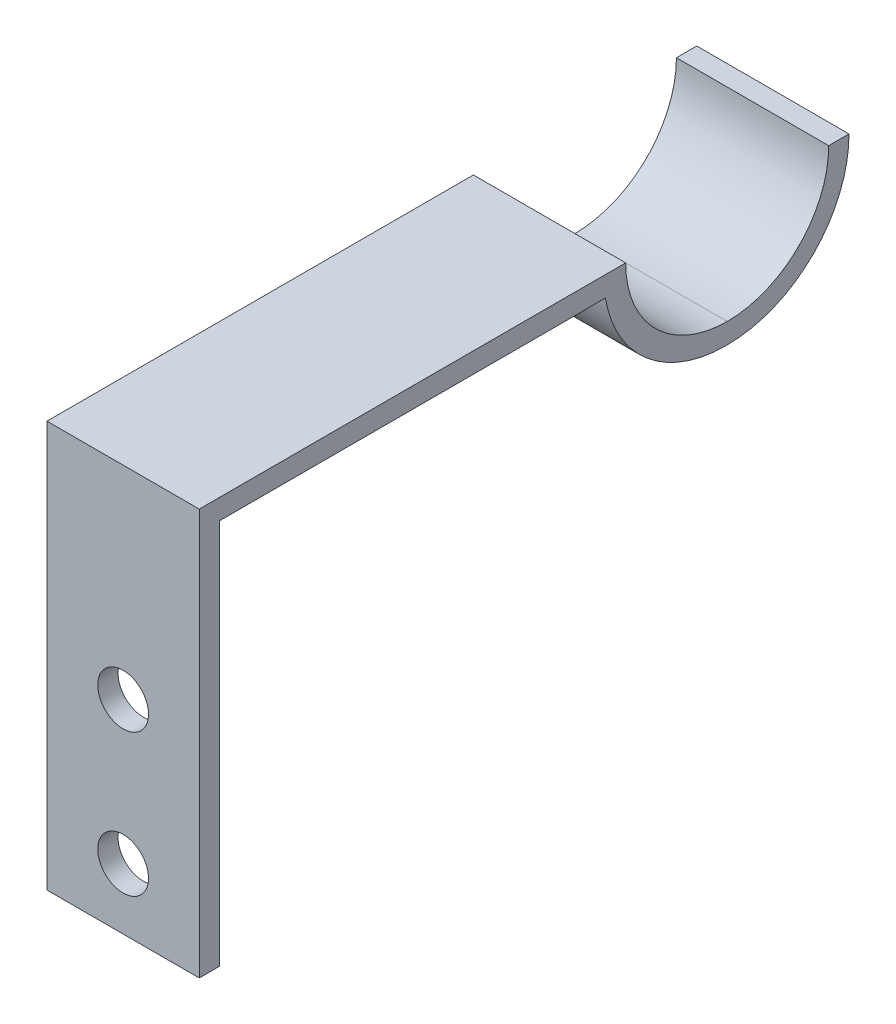
ISO-10303-21;
HEADER;
FILE_DESCRIPTION(('STEP AP214'),'2;1');
FILE_NAME('part.step','',(''),(''),'','','');
FILE_SCHEMA(('AUTOMOTIVE_DESIGN { 1 0 10303 214 1 1 1 1 }'));
ENDSEC;
DATA;
#1=APPLICATION_CONTEXT('core data for automotive mechanical design processes');
#2=APPLICATION_PROTOCOL_DEFINITION('international standard','automotive_design',2000,#1);
#3=PRODUCT_CONTEXT('',#1,'mechanical');
#4=PRODUCT('Part','Part','',(#3));
#5=PRODUCT_RELATED_PRODUCT_CATEGORY('part','',(#4));
#6=PRODUCT_DEFINITION_FORMATION('','',#4);
#7=PRODUCT_DEFINITION_CONTEXT('part definition',#1,'design');
#8=PRODUCT_DEFINITION('design','',#6,#7);
#9=PRODUCT_DEFINITION_SHAPE('','',#8);
#10=(LENGTH_UNIT() NAMED_UNIT(*) SI_UNIT(.MILLI.,.METRE.));
#11=(NAMED_UNIT(*) PLANE_ANGLE_UNIT() SI_UNIT($,.RADIAN.));
#12=(NAMED_UNIT(*) SI_UNIT($,.STERADIAN.) SOLID_ANGLE_UNIT());
#13=UNCERTAINTY_MEASURE_WITH_UNIT(LENGTH_MEASURE(1.E-05),#10,'distance_accuracy_value','');
#14=(GEOMETRIC_REPRESENTATION_CONTEXT(3) GLOBAL_UNCERTAINTY_ASSIGNED_CONTEXT((#13)) GLOBAL_UNIT_ASSIGNED_CONTEXT((#10,
#11,#12)) REPRESENTATION_CONTEXT('',''));
#15=CARTESIAN_POINT('',(0.,0.,0.));
#16=DIRECTION('',(0.,0.,1.));
#17=DIRECTION('',(1.,0.,0.));
#18=AXIS2_PLACEMENT_3D('',#15,#16,#17);
#19=CARTESIAN_POINT('',(0.,0.,0.));
#20=DIRECTION('',(0.,0.,1.));
#21=DIRECTION('',(1.,0.,0.));
#22=AXIS2_PLACEMENT_3D('',#19,#20,#21);
#23=PLANE('',#22);
#24=CARTESIAN_POINT('',(-165.075387596899,33.8666666666667,0.));
#25=DIRECTION('',(0.,0.,1.));
#26=DIRECTION('',(1.,0.,0.));
#27=AXIS2_PLACEMENT_3D('',#24,#25,#26);
#28=CIRCLE('',#27,3.175);
#29=CARTESIAN_POINT('',(-161.900387596899,33.8666666666667,0.));
#30=VERTEX_POINT('',#29);
#31=EDGE_CURVE('E156',#30,#30,#28,.T.);
#32=ORIENTED_EDGE('',*,*,#31,.T.);
#33=EDGE_LOOP('',(#32));
#34=FACE_BOUND('',#33,.T.);
#35=CARTESIAN_POINT('',(-165.075387596899,16.0866666666667,0.));
#36=DIRECTION('',(0.,0.,1.));
#37=DIRECTION('',(1.,0.,0.));
#38=AXIS2_PLACEMENT_3D('',#35,#36,#37);
#39=CIRCLE('',#38,3.175);
#40=CARTESIAN_POINT('',(-161.900387596899,16.0866666666667,0.));
#41=VERTEX_POINT('',#40);
#42=EDGE_CURVE('E160',#41,#41,#39,.T.);
#43=ORIENTED_EDGE('',*,*,#42,.T.);
#44=EDGE_LOOP('',(#43));
#45=FACE_BOUND('',#44,.T.);
#46=DIRECTION('',(-1.,0.,0.));
#47=VECTOR('',#46,1.);
#48=CARTESIAN_POINT('',(-155.550387596899,56.7266666666666,0.));
#49=LINE('',#48,#47);
#50=CARTESIAN_POINT('',(-155.550387596899,56.7266666666666,0.));
#51=VERTEX_POINT('',#50);
#52=CARTESIAN_POINT('',(-174.600387596899,56.7266666666666,0.));
#53=VERTEX_POINT('',#52);
#54=EDGE_CURVE('E137',#51,#53,#49,.T.);
#55=ORIENTED_EDGE('',*,*,#54,.F.);
#56=DIRECTION('',(0.,1.,0.));
#57=VECTOR('',#56,1.);
#58=CARTESIAN_POINT('',(-155.550387596899,59.2666666666667,0.));
#59=LINE('',#58,#57);
#60=CARTESIAN_POINT('',(-155.550387596899,8.46666666666666,0.));
#61=VERTEX_POINT('',#60);
#62=EDGE_CURVE('E173',#61,#51,#59,.T.);
#63=ORIENTED_EDGE('',*,*,#62,.F.);
#64=DIRECTION('',(1.,0.,0.));
#65=VECTOR('',#64,1.);
#66=CARTESIAN_POINT('',(-174.600387596899,8.46666666666666,0.));
#67=LINE('',#66,#65);
#68=CARTESIAN_POINT('',(-174.600387596899,8.46666666666666,0.));
#69=VERTEX_POINT('',#68);
#70=EDGE_CURVE('E181',#69,#61,#67,.T.);
#71=ORIENTED_EDGE('',*,*,#70,.F.);
#72=DIRECTION('',(0.,-1.,0.));
#73=VECTOR('',#72,1.);
#74=CARTESIAN_POINT('',(-174.600387596899,59.2666666666667,0.));
#75=LINE('',#74,#73);
#76=EDGE_CURVE('E166',#53,#69,#75,.T.);
#77=ORIENTED_EDGE('',*,*,#76,.F.);
#78=EDGE_LOOP('',(#55,#63,#71,#77));
#79=FACE_BOUND('',#78,.T.);
#80=ADVANCED_FACE('F37',(#34,#45,#79),#23,.F.);
#81=CARTESIAN_POINT('',(0.,0.,2.54));
#82=DIRECTION('',(0.,0.,1.));
#83=DIRECTION('',(1.,0.,0.));
#84=AXIS2_PLACEMENT_3D('',#81,#82,#83);
#85=PLANE('',#84);
#86=CARTESIAN_POINT('',(-165.075387596899,16.0866666666667,2.54));
#87=DIRECTION('',(0.,0.,1.));
#88=DIRECTION('',(1.,0.,0.));
#89=AXIS2_PLACEMENT_3D('',#86,#87,#88);
#90=CIRCLE('',#89,3.175);
#91=CARTESIAN_POINT('',(-161.900387596899,16.0866666666667,2.54));
#92=VERTEX_POINT('',#91);
#93=EDGE_CURVE('E163',#92,#92,#90,.T.);
#94=ORIENTED_EDGE('',*,*,#93,.F.);
#95=EDGE_LOOP('',(#94));
#96=FACE_BOUND('',#95,.T.);
#97=DIRECTION('',(0.,-1.,0.));
#98=VECTOR('',#97,1.);
#99=CARTESIAN_POINT('',(-174.600387596899,59.2666666666667,2.54));
#100=LINE('',#99,#98);
#101=CARTESIAN_POINT('',(-174.600387596899,59.2666666666667,2.54));
#102=VERTEX_POINT('',#101);
#103=CARTESIAN_POINT('',(-174.600387596899,8.46666666666666,2.54));
#104=VERTEX_POINT('',#103);
#105=EDGE_CURVE('E169',#102,#104,#100,.T.);
#106=ORIENTED_EDGE('',*,*,#105,.T.);
#107=DIRECTION('',(1.,0.,0.));
#108=VECTOR('',#107,1.);
#109=CARTESIAN_POINT('',(-174.600387596899,8.46666666666666,2.54));
#110=LINE('',#109,#108);
#111=CARTESIAN_POINT('',(-155.550387596899,8.46666666666666,2.54));
#112=VERTEX_POINT('',#111);
#113=EDGE_CURVE('E172',#104,#112,#110,.T.);
#114=ORIENTED_EDGE('',*,*,#113,.T.);
#115=DIRECTION('',(0.,1.,0.));
#116=VECTOR('',#115,1.);
#117=CARTESIAN_POINT('',(-155.550387596899,59.2666666666667,2.54));
#118=LINE('',#117,#116);
#119=CARTESIAN_POINT('',(-155.550387596899,59.2666666666667,2.54));
#120=VERTEX_POINT('',#119);
#121=EDGE_CURVE('E175',#112,#120,#118,.T.);
#122=ORIENTED_EDGE('',*,*,#121,.T.);
#123=DIRECTION('',(-1.,0.,0.));
#124=VECTOR('',#123,1.);
#125=CARTESIAN_POINT('',(-174.600387596899,59.2666666666667,2.54));
#126=LINE('',#125,#124);
#127=EDGE_CURVE('E177',#120,#102,#126,.T.);
#128=ORIENTED_EDGE('',*,*,#127,.T.);
#129=EDGE_LOOP('',(#106,#114,#122,#128));
#130=FACE_BOUND('',#129,.T.);
#131=CARTESIAN_POINT('',(-165.075387596899,33.8666666666667,2.54));
#132=DIRECTION('',(0.,0.,1.));
#133=DIRECTION('',(1.,0.,0.));
#134=AXIS2_PLACEMENT_3D('',#131,#132,#133);
#135=CIRCLE('',#134,3.175);
#136=CARTESIAN_POINT('',(-161.900387596899,33.8666666666667,2.54));
#137=VERTEX_POINT('',#136);
#138=EDGE_CURVE('E157',#137,#137,#135,.T.);
#139=ORIENTED_EDGE('',*,*,#138,.F.);
#140=EDGE_LOOP('',(#139));
#141=FACE_BOUND('',#140,.T.);
#142=ADVANCED_FACE('F237',(#96,#130,#141),#85,.T.);
#143=CARTESIAN_POINT('',(-174.600387596899,59.2666666666667,2.54));
#144=DIRECTION('',(1.,0.,0.));
#145=DIRECTION('',(0.,0.,-1.));
#146=AXIS2_PLACEMENT_3D('',#143,#144,#145);
#147=PLANE('',#146);
#148=DIRECTION('',(0.,0.,1.));
#149=VECTOR('',#148,1.);
#150=CARTESIAN_POINT('',(-174.600387596899,59.2666666666667,-76.2));
#151=LINE('',#150,#149);
#152=CARTESIAN_POINT('',(-174.600387596899,59.2666666666667,-78.74));
#153=VERTEX_POINT('',#152);
#154=CARTESIAN_POINT('',(-174.600387596899,59.2666666666667,-76.2));
#155=VERTEX_POINT('',#154);
#156=EDGE_CURVE('E144',#153,#155,#151,.T.);
#157=ORIENTED_EDGE('',*,*,#156,.F.);
#158=CARTESIAN_POINT('',(-174.600387596899,59.2666666666666,-63.5));
#159=DIRECTION('',(1.,0.,0.));
#160=DIRECTION('',(0.,0.,-1.));
#161=AXIS2_PLACEMENT_3D('',#158,#159,#160);
#162=CIRCLE('',#161,15.24);
#163=CARTESIAN_POINT('',(-174.600387596899,44.0266666666666,-63.5));
#164=VERTEX_POINT('',#163);
#165=EDGE_CURVE('E11',#153,#164,#162,.F.);
#166=ORIENTED_EDGE('',*,*,#165,.T.);
#167=DIRECTION('',(0.,0.,-1.));
#168=VECTOR('',#167,1.);
#169=CARTESIAN_POINT('',(-174.600387596899,44.0266666666666,-48.26));
#170=LINE('',#169,#168);
#171=CARTESIAN_POINT('',(-174.600387596899,44.0266666666666,-63.286842649073));
#172=VERTEX_POINT('',#171);
#173=EDGE_CURVE('E123',#172,#164,#170,.T.);
#174=ORIENTED_EDGE('',*,*,#173,.F.);
#175=CARTESIAN_POINT('',(-174.600387596899,59.2666666666666,-63.286842649073));
#176=DIRECTION('',(1.,0.,0.));
#177=DIRECTION('',(0.,0.,-1.));
#178=AXIS2_PLACEMENT_3D('',#175,#176,#177);
#179=CIRCLE('',#178,15.24);
#180=CARTESIAN_POINT('',(-174.600387596899,56.7266666666666,-48.26));
#181=VERTEX_POINT('',#180);
#182=EDGE_CURVE('E118',#172,#181,#179,.F.);
#183=ORIENTED_EDGE('',*,*,#182,.T.);
#184=DIRECTION('',(0.,0.,1.));
#185=VECTOR('',#184,1.);
#186=CARTESIAN_POINT('',(-174.600387596899,56.7266666666666,-50.8));
#187=LINE('',#186,#185);
#188=EDGE_CURVE('E121',#181,#53,#187,.T.);
#189=ORIENTED_EDGE('',*,*,#188,.T.);
#190=ORIENTED_EDGE('',*,*,#76,.T.);
#191=DIRECTION('',(0.,0.,-1.));
#192=VECTOR('',#191,1.);
#193=CARTESIAN_POINT('',(-174.600387596899,8.46666666666666,2.54));
#194=LINE('',#193,#192);
#195=EDGE_CURVE('E192',#104,#69,#194,.T.);
#196=ORIENTED_EDGE('',*,*,#195,.F.);
#197=ORIENTED_EDGE('',*,*,#105,.F.);
#198=DIRECTION('',(0.,0.,-1.));
#199=VECTOR('',#198,1.);
#200=CARTESIAN_POINT('',(-174.600387596899,59.2666666666667,2.54));
#201=LINE('',#200,#199);
#202=CARTESIAN_POINT('',(-174.600387596899,59.2666666666667,-50.8));
#203=VERTEX_POINT('',#202);
#204=EDGE_CURVE('E179',#102,#203,#201,.T.);
#205=ORIENTED_EDGE('',*,*,#204,.T.);
#206=CARTESIAN_POINT('',(-174.600387596899,59.2666666666666,-63.5));
#207=DIRECTION('',(1.,0.,0.));
#208=DIRECTION('',(0.,0.,-1.));
#209=AXIS2_PLACEMENT_3D('',#206,#207,#208);
#210=CIRCLE('',#209,12.7);
#211=CARTESIAN_POINT('',(-174.600387596899,46.5666666666666,-63.5));
#212=VERTEX_POINT('',#211);
#213=EDGE_CURVE('E200',#203,#212,#210,.T.);
#214=ORIENTED_EDGE('',*,*,#213,.T.);
#215=CARTESIAN_POINT('',(-174.600387596899,59.2666666666666,-63.5));
#216=DIRECTION('',(1.,0.,0.));
#217=DIRECTION('',(0.,0.,-1.));
#218=AXIS2_PLACEMENT_3D('',#215,#216,#217);
#219=CIRCLE('',#218,12.7);
#220=EDGE_CURVE('E205',#212,#155,#219,.T.);
#221=ORIENTED_EDGE('',*,*,#220,.T.);
#222=EDGE_LOOP('',(#157,#166,#174,#183,#189,#190,#196,#197,#205,#214,#221));
#223=FACE_BOUND('',#222,.T.);
#224=ADVANCED_FACE('F120',(#223),#147,.F.);
#225=CARTESIAN_POINT('',(-174.600387596899,8.46666666666666,2.54));
#226=DIRECTION('',(0.,1.,0.));
#227=DIRECTION('',(0.,0.,1.));
#228=AXIS2_PLACEMENT_3D('',#225,#226,#227);
#229=PLANE('',#228);
#230=ORIENTED_EDGE('',*,*,#70,.T.);
#231=DIRECTION('',(0.,0.,-1.));
#232=VECTOR('',#231,1.);
#233=CARTESIAN_POINT('',(-155.550387596899,8.46666666666666,2.54));
#234=LINE('',#233,#232);
#235=EDGE_CURVE('E189',#112,#61,#234,.T.);
#236=ORIENTED_EDGE('',*,*,#235,.F.);
#237=ORIENTED_EDGE('',*,*,#113,.F.);
#238=ORIENTED_EDGE('',*,*,#195,.T.);
#239=EDGE_LOOP('',(#230,#236,#237,#238));
#240=FACE_BOUND('',#239,.T.);
#241=ADVANCED_FACE('F255',(#240),#229,.F.);
#242=CARTESIAN_POINT('',(-155.550387596899,59.2666666666667,2.54));
#243=DIRECTION('',(-1.,0.,0.));
#244=DIRECTION('',(0.,0.,1.));
#245=AXIS2_PLACEMENT_3D('',#242,#243,#244);
#246=PLANE('',#245);
#247=DIRECTION('',(0.,0.,-1.));
#248=VECTOR('',#247,1.);
#249=CARTESIAN_POINT('',(-155.550387596899,44.0266666666666,-48.26));
#250=LINE('',#249,#248);
#251=CARTESIAN_POINT('',(-155.550387596899,44.0266666666666,-63.286842649073));
#252=VERTEX_POINT('',#251);
#253=CARTESIAN_POINT('',(-155.550387596899,44.0266666666666,-63.5));
#254=VERTEX_POINT('',#253);
#255=EDGE_CURVE('E215',#252,#254,#250,.T.);
#256=ORIENTED_EDGE('',*,*,#255,.T.);
#257=CARTESIAN_POINT('',(-155.550387596899,59.2666666666666,-63.5));
#258=DIRECTION('',(-1.,0.,0.));
#259=DIRECTION('',(0.,0.,1.));
#260=AXIS2_PLACEMENT_3D('',#257,#258,#259);
#261=CIRCLE('',#260,15.24);
#262=CARTESIAN_POINT('',(-155.550387596899,59.2666666666667,-78.74));
#263=VERTEX_POINT('',#262);
#264=EDGE_CURVE('E45',#254,#263,#261,.F.);
#265=ORIENTED_EDGE('',*,*,#264,.T.);
#266=DIRECTION('',(0.,0.,1.));
#267=VECTOR('',#266,1.);
#268=CARTESIAN_POINT('',(-155.550387596899,59.2666666666667,-76.2));
#269=LINE('',#268,#267);
#270=CARTESIAN_POINT('',(-155.550387596899,59.2666666666667,-76.2));
#271=VERTEX_POINT('',#270);
#272=EDGE_CURVE('E213',#263,#271,#269,.T.);
#273=ORIENTED_EDGE('',*,*,#272,.T.);
#274=CARTESIAN_POINT('',(-155.550387596899,59.2666666666666,-63.5));
#275=DIRECTION('',(-1.,0.,0.));
#276=DIRECTION('',(0.,0.,1.));
#277=AXIS2_PLACEMENT_3D('',#274,#275,#276);
#278=CIRCLE('',#277,12.7);
#279=CARTESIAN_POINT('',(-155.550387596899,46.5666666666666,-63.5));
#280=VERTEX_POINT('',#279);
#281=EDGE_CURVE('E127',#271,#280,#278,.T.);
#282=ORIENTED_EDGE('',*,*,#281,.T.);
#283=CARTESIAN_POINT('',(-155.550387596899,59.2666666666666,-63.5));
#284=DIRECTION('',(-1.,0.,0.));
#285=DIRECTION('',(0.,0.,1.));
#286=AXIS2_PLACEMENT_3D('',#283,#284,#285);
#287=CIRCLE('',#286,12.7);
#288=CARTESIAN_POINT('',(-155.550387596899,59.2666666666667,-50.8));
#289=VERTEX_POINT('',#288);
#290=EDGE_CURVE('E198',#280,#289,#287,.T.);
#291=ORIENTED_EDGE('',*,*,#290,.T.);
#292=DIRECTION('',(0.,0.,-1.));
#293=VECTOR('',#292,1.);
#294=CARTESIAN_POINT('',(-155.550387596899,59.2666666666667,2.54));
#295=LINE('',#294,#293);
#296=EDGE_CURVE('E186',#120,#289,#295,.T.);
#297=ORIENTED_EDGE('',*,*,#296,.F.);
#298=ORIENTED_EDGE('',*,*,#121,.F.);
#299=ORIENTED_EDGE('',*,*,#235,.T.);
#300=ORIENTED_EDGE('',*,*,#62,.T.);
#301=DIRECTION('',(0.,0.,1.));
#302=VECTOR('',#301,1.);
#303=CARTESIAN_POINT('',(-155.550387596899,56.7266666666666,-50.8));
#304=LINE('',#303,#302);
#305=CARTESIAN_POINT('',(-155.550387596899,56.7266666666666,-48.26));
#306=VERTEX_POINT('',#305);
#307=EDGE_CURVE('E138',#306,#51,#304,.T.);
#308=ORIENTED_EDGE('',*,*,#307,.F.);
#309=CARTESIAN_POINT('',(-155.550387596899,59.2666666666666,-63.286842649073));
#310=DIRECTION('',(-1.,0.,0.));
#311=DIRECTION('',(0.,0.,1.));
#312=AXIS2_PLACEMENT_3D('',#309,#310,#311);
#313=CIRCLE('',#312,15.24);
#314=EDGE_CURVE('E142',#306,#252,#313,.F.);
#315=ORIENTED_EDGE('',*,*,#314,.T.);
#316=EDGE_LOOP('',(#256,#265,#273,#282,#291,#297,#298,#299,#300,#308,#315));
#317=FACE_BOUND('',#316,.T.);
#318=ADVANCED_FACE('F212',(#317),#246,.F.);
#319=CARTESIAN_POINT('',(-174.600387596899,59.2666666666667,2.54));
#320=DIRECTION('',(0.,-1.,0.));
#321=DIRECTION('',(1.,0.,0.));
#322=AXIS2_PLACEMENT_3D('',#319,#320,#321);
#323=PLANE('',#322);
#324=ORIENTED_EDGE('',*,*,#296,.T.);
#325=DIRECTION('',(1.,0.,0.));
#326=VECTOR('',#325,1.);
#327=CARTESIAN_POINT('',(-174.600387596899,59.2666666666667,-50.8));
#328=LINE('',#327,#326);
#329=EDGE_CURVE('E139',#203,#289,#328,.T.);
#330=ORIENTED_EDGE('',*,*,#329,.F.);
#331=ORIENTED_EDGE('',*,*,#204,.F.);
#332=ORIENTED_EDGE('',*,*,#127,.F.);
#333=EDGE_LOOP('',(#324,#330,#331,#332));
#334=FACE_BOUND('',#333,.T.);
#335=ADVANCED_FACE('F248',(#334),#323,.F.);
#336=CARTESIAN_POINT('',(-165.075387596899,16.0866666666667,2.54));
#337=DIRECTION('',(0.,0.,-1.));
#338=DIRECTION('',(-1.,0.,0.));
#339=AXIS2_PLACEMENT_3D('',#336,#337,#338);
#340=CYLINDRICAL_SURFACE('',#339,3.175);
#341=ORIENTED_EDGE('',*,*,#93,.T.);
#342=EDGE_LOOP('',(#341));
#343=FACE_BOUND('',#342,.T.);
#344=ORIENTED_EDGE('',*,*,#42,.F.);
#345=EDGE_LOOP('',(#344));
#346=FACE_BOUND('',#345,.T.);
#347=ADVANCED_FACE('F251',(#343,#346),#340,.F.);
#348=CARTESIAN_POINT('',(-165.075387596899,33.8666666666667,2.54));
#349=DIRECTION('',(0.,0.,-1.));
#350=DIRECTION('',(-1.,0.,0.));
#351=AXIS2_PLACEMENT_3D('',#348,#349,#350);
#352=CYLINDRICAL_SURFACE('',#351,3.175);
#353=ORIENTED_EDGE('',*,*,#138,.T.);
#354=EDGE_LOOP('',(#353));
#355=FACE_BOUND('',#354,.T.);
#356=ORIENTED_EDGE('',*,*,#31,.F.);
#357=EDGE_LOOP('',(#356));
#358=FACE_BOUND('',#357,.T.);
#359=ADVANCED_FACE('F287',(#355,#358),#352,.F.);
#360=CARTESIAN_POINT('',(-155.550387596899,56.7266666666666,-50.8));
#361=DIRECTION('',(0.,1.,0.));
#362=DIRECTION('',(0.,0.,1.));
#363=AXIS2_PLACEMENT_3D('',#360,#361,#362);
#364=PLANE('',#363);
#365=ORIENTED_EDGE('',*,*,#188,.F.);
#366=DIRECTION('',(1.,0.,0.));
#367=VECTOR('',#366,1.);
#368=CARTESIAN_POINT('',(-174.600387596899,56.7266666666666,-48.26));
#369=LINE('',#368,#367);
#370=EDGE_CURVE('E134',#181,#306,#369,.T.);
#371=ORIENTED_EDGE('',*,*,#370,.T.);
#372=ORIENTED_EDGE('',*,*,#307,.T.);
#373=ORIENTED_EDGE('',*,*,#54,.T.);
#374=EDGE_LOOP('',(#365,#371,#372,#373));
#375=FACE_BOUND('',#374,.T.);
#376=ADVANCED_FACE('F133',(#375),#364,.F.);
#377=CARTESIAN_POINT('',(-174.600387596899,59.2666666666667,-76.2));
#378=DIRECTION('',(0.,1.,0.));
#379=DIRECTION('',(0.,0.,1.));
#380=AXIS2_PLACEMENT_3D('',#377,#378,#379);
#381=PLANE('',#380);
#382=ORIENTED_EDGE('',*,*,#272,.F.);
#383=DIRECTION('',(1.,0.,0.));
#384=VECTOR('',#383,1.);
#385=CARTESIAN_POINT('',(-174.600387596899,59.2666666666667,-78.74));
#386=LINE('',#385,#384);
#387=EDGE_CURVE('E143',#153,#263,#386,.T.);
#388=ORIENTED_EDGE('',*,*,#387,.F.);
#389=ORIENTED_EDGE('',*,*,#156,.T.);
#390=DIRECTION('',(1.,0.,0.));
#391=VECTOR('',#390,1.);
#392=CARTESIAN_POINT('',(-174.600387596899,59.2666666666667,-76.2));
#393=LINE('',#392,#391);
#394=EDGE_CURVE('E146',#155,#271,#393,.T.);
#395=ORIENTED_EDGE('',*,*,#394,.T.);
#396=EDGE_LOOP('',(#382,#388,#389,#395));
#397=FACE_BOUND('',#396,.T.);
#398=ADVANCED_FACE('F218',(#397),#381,.T.);
#399=CARTESIAN_POINT('',(-174.600387596899,44.0266666666666,-48.26));
#400=DIRECTION('',(0.,-1.,0.));
#401=DIRECTION('',(0.,0.,-1.));
#402=AXIS2_PLACEMENT_3D('',#399,#400,#401);
#403=PLANE('',#402);
#404=ORIENTED_EDGE('',*,*,#173,.T.);
#405=DIRECTION('',(1.,0.,0.));
#406=VECTOR('',#405,1.);
#407=CARTESIAN_POINT('',(-174.600387596899,44.0266666666666,-63.5));
#408=LINE('',#407,#406);
#409=EDGE_CURVE('E207',#164,#254,#408,.T.);
#410=ORIENTED_EDGE('',*,*,#409,.T.);
#411=ORIENTED_EDGE('',*,*,#255,.F.);
#412=DIRECTION('',(1.,0.,0.));
#413=VECTOR('',#412,1.);
#414=CARTESIAN_POINT('',(-174.600387596899,44.0266666666666,-63.286842649073));
#415=LINE('',#414,#413);
#416=EDGE_CURVE('E128',#252,#172,#415,.F.);
#417=ORIENTED_EDGE('',*,*,#416,.T.);
#418=EDGE_LOOP('',(#404,#410,#411,#417));
#419=FACE_BOUND('',#418,.T.);
#420=ADVANCED_FACE('F222',(#419),#403,.T.);
#421=CARTESIAN_POINT('',(-174.600387596899,59.2666666666666,-63.5));
#422=DIRECTION('',(-1.,0.,0.));
#423=DIRECTION('',(0.,0.,1.));
#424=AXIS2_PLACEMENT_3D('',#421,#422,#423);
#425=CYLINDRICAL_SURFACE('',#424,12.7);
#426=ORIENTED_EDGE('',*,*,#213,.F.);
#427=ORIENTED_EDGE('',*,*,#329,.T.);
#428=ORIENTED_EDGE('',*,*,#290,.F.);
#429=DIRECTION('',(1.,0.,0.));
#430=VECTOR('',#429,1.);
#431=CARTESIAN_POINT('',(-155.550387596899,46.5666666666666,-63.5));
#432=LINE('',#431,#430);
#433=EDGE_CURVE('E195',#212,#280,#432,.T.);
#434=ORIENTED_EDGE('',*,*,#433,.F.);
#435=EDGE_LOOP('',(#426,#427,#428,#434));
#436=FACE_BOUND('',#435,.T.);
#437=ADVANCED_FACE('F226',(#436),#425,.F.);
#438=CARTESIAN_POINT('',(-174.600387596899,59.2666666666666,-63.286842649073));
#439=DIRECTION('',(-1.,0.,0.));
#440=DIRECTION('',(0.,0.,1.));
#441=AXIS2_PLACEMENT_3D('',#438,#439,#440);
#442=CYLINDRICAL_SURFACE('',#441,15.24);
#443=ORIENTED_EDGE('',*,*,#182,.F.);
#444=ORIENTED_EDGE('',*,*,#416,.F.);
#445=ORIENTED_EDGE('',*,*,#314,.F.);
#446=ORIENTED_EDGE('',*,*,#370,.F.);
#447=EDGE_LOOP('',(#443,#444,#445,#446));
#448=FACE_BOUND('',#447,.T.);
#449=ADVANCED_FACE('F141',(#448),#442,.T.);
#450=CARTESIAN_POINT('',(-174.600387596899,59.2666666666666,-63.5));
#451=DIRECTION('',(-1.,0.,0.));
#452=DIRECTION('',(0.,0.,1.));
#453=AXIS2_PLACEMENT_3D('',#450,#451,#452);
#454=CYLINDRICAL_SURFACE('',#453,12.7);
#455=ORIENTED_EDGE('',*,*,#220,.F.);
#456=ORIENTED_EDGE('',*,*,#433,.T.);
#457=ORIENTED_EDGE('',*,*,#281,.F.);
#458=ORIENTED_EDGE('',*,*,#394,.F.);
#459=EDGE_LOOP('',(#455,#456,#457,#458));
#460=FACE_BOUND('',#459,.T.);
#461=ADVANCED_FACE('F262',(#460),#454,.F.);
#462=CARTESIAN_POINT('',(-174.600387596899,59.2666666666666,-63.5));
#463=DIRECTION('',(1.,0.,0.));
#464=DIRECTION('',(0.,0.,-1.));
#465=AXIS2_PLACEMENT_3D('',#462,#463,#464);
#466=CYLINDRICAL_SURFACE('',#465,15.24);
#467=ORIENTED_EDGE('',*,*,#165,.F.);
#468=ORIENTED_EDGE('',*,*,#387,.T.);
#469=ORIENTED_EDGE('',*,*,#264,.F.);
#470=ORIENTED_EDGE('',*,*,#409,.F.);
#471=EDGE_LOOP('',(#467,#468,#469,#470));
#472=FACE_BOUND('',#471,.T.);
#473=ADVANCED_FACE('F39',(#472),#466,.T.);
#474=CLOSED_SHELL('',(#80,#142,#224,#241,#318,#335,#347,#359,#376,#398,#420,#437,#449,#461,#473));
#475=MANIFOLD_SOLID_BREP('B2',#474);
#476=ADVANCED_BREP_SHAPE_REPRESENTATION('',(#18,#475),#14);
#477=SHAPE_DEFINITION_REPRESENTATION(#9,#476);
ENDSEC;
END-ISO-10303-21;
